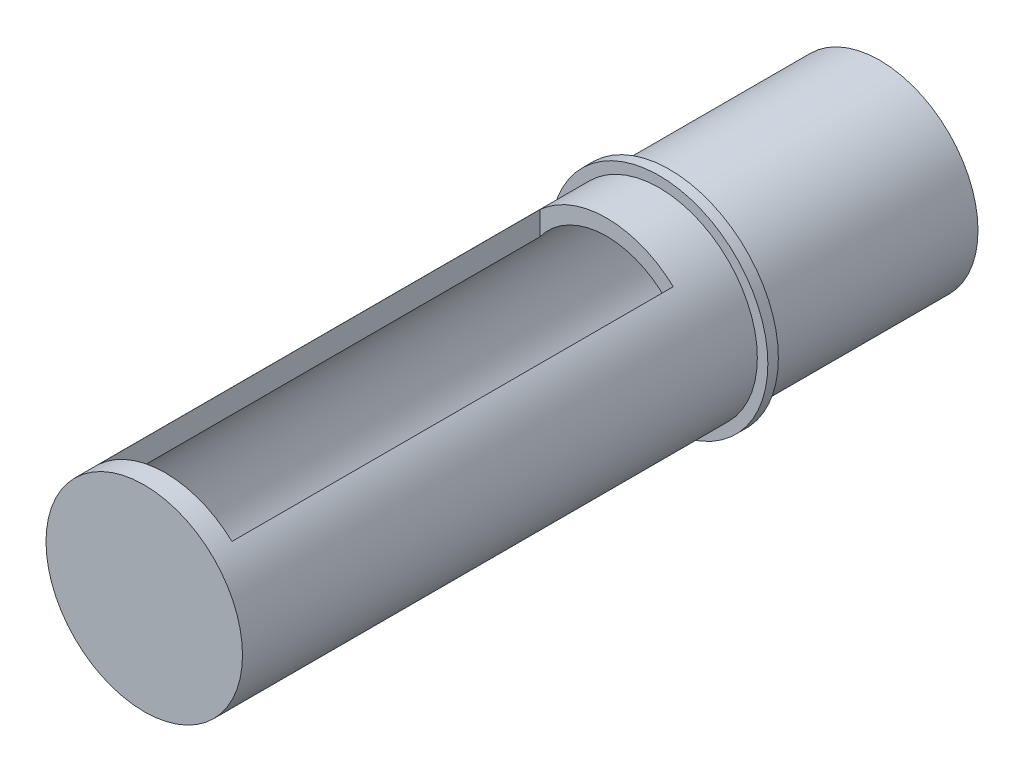
ISO-10303-21;
HEADER;
FILE_DESCRIPTION(('STEP AP214'),'2;1');
FILE_NAME('part.step','',(''),(''),'','','');
FILE_SCHEMA(('AUTOMOTIVE_DESIGN { 1 0 10303 214 1 1 1 1 }'));
ENDSEC;
DATA;
#1=APPLICATION_CONTEXT('core data for automotive mechanical design processes');
#2=APPLICATION_PROTOCOL_DEFINITION('international standard','automotive_design',2000,#1);
#3=PRODUCT_CONTEXT('',#1,'mechanical');
#4=PRODUCT('Part','Part','',(#3));
#5=PRODUCT_RELATED_PRODUCT_CATEGORY('part','',(#4));
#6=PRODUCT_DEFINITION_FORMATION('','',#4);
#7=PRODUCT_DEFINITION_CONTEXT('part definition',#1,'design');
#8=PRODUCT_DEFINITION('design','',#6,#7);
#9=PRODUCT_DEFINITION_SHAPE('','',#8);
#10=(LENGTH_UNIT() NAMED_UNIT(*) SI_UNIT(.MILLI.,.METRE.));
#11=(NAMED_UNIT(*) PLANE_ANGLE_UNIT() SI_UNIT($,.RADIAN.));
#12=(NAMED_UNIT(*) SI_UNIT($,.STERADIAN.) SOLID_ANGLE_UNIT());
#13=UNCERTAINTY_MEASURE_WITH_UNIT(LENGTH_MEASURE(1.E-05),#10,'distance_accuracy_value','');
#14=(GEOMETRIC_REPRESENTATION_CONTEXT(3) GLOBAL_UNCERTAINTY_ASSIGNED_CONTEXT((#13)) GLOBAL_UNIT_ASSIGNED_CONTEXT((#10,
#11,#12)) REPRESENTATION_CONTEXT('',''));
#15=CARTESIAN_POINT('',(0.,0.,0.));
#16=DIRECTION('',(0.,0.,1.));
#17=DIRECTION('',(1.,0.,0.));
#18=AXIS2_PLACEMENT_3D('',#15,#16,#17);
#19=CARTESIAN_POINT('',(0.,0.,-20.));
#20=DIRECTION('',(0.,0.,1.));
#21=DIRECTION('',(1.,0.,0.));
#22=AXIS2_PLACEMENT_3D('',#19,#20,#21);
#23=CYLINDRICAL_SURFACE('',#22,7.85);
#24=CARTESIAN_POINT('',(0.,0.,-20.));
#25=DIRECTION('',(0.,0.,1.));
#26=DIRECTION('',(1.,0.,0.));
#27=AXIS2_PLACEMENT_3D('',#24,#25,#26);
#28=CIRCLE('',#27,7.85);
#29=CARTESIAN_POINT('',(7.85,0.,-20.));
#30=VERTEX_POINT('',#29);
#31=EDGE_CURVE('E111',#30,#30,#28,.T.);
#32=ORIENTED_EDGE('',*,*,#31,.F.);
#33=EDGE_LOOP('',(#32));
#34=FACE_BOUND('',#33,.T.);
#35=DIRECTION('',(0.,0.,1.));
#36=VECTOR('',#35,1.);
#37=CARTESIAN_POINT('',(6.35,4.61519230368573,-20.));
#38=LINE('',#37,#36);
#39=CARTESIAN_POINT('',(6.35,4.61519230368573,6.));
#40=VERTEX_POINT('',#39);
#41=CARTESIAN_POINT('',(6.35,4.61519230368573,48.));
#42=VERTEX_POINT('',#41);
#43=EDGE_CURVE('E133',#40,#42,#38,.T.);
#44=ORIENTED_EDGE('',*,*,#43,.F.);
#45=CARTESIAN_POINT('',(0.,0.,6.));
#46=DIRECTION('',(0.,0.,1.));
#47=DIRECTION('',(1.,0.,0.));
#48=AXIS2_PLACEMENT_3D('',#45,#46,#47);
#49=CIRCLE('',#48,7.85);
#50=CARTESIAN_POINT('',(-6.35,4.61519230368573,6.));
#51=VERTEX_POINT('',#50);
#52=EDGE_CURVE('E94',#51,#40,#49,.F.);
#53=ORIENTED_EDGE('',*,*,#52,.F.);
#54=DIRECTION('',(0.,0.,1.));
#55=VECTOR('',#54,1.);
#56=CARTESIAN_POINT('',(-6.35,4.61519230368573,-20.));
#57=LINE('',#56,#55);
#58=CARTESIAN_POINT('',(-6.35,4.61519230368573,48.));
#59=VERTEX_POINT('',#58);
#60=EDGE_CURVE('E81',#59,#51,#57,.F.);
#61=ORIENTED_EDGE('',*,*,#60,.F.);
#62=CARTESIAN_POINT('',(0.,0.,48.));
#63=DIRECTION('',(0.,0.,1.));
#64=DIRECTION('',(1.,0.,0.));
#65=AXIS2_PLACEMENT_3D('',#62,#63,#64);
#66=CIRCLE('',#65,7.85);
#67=EDGE_CURVE('E93',#42,#59,#66,.F.);
#68=ORIENTED_EDGE('',*,*,#67,.F.);
#69=EDGE_LOOP('',(#44,#53,#61,#68));
#70=FACE_BOUND('',#69,.T.);
#71=ADVANCED_FACE('F39',(#34,#70),#23,.F.);
#72=CARTESIAN_POINT('',(0.,0.,-20.));
#73=DIRECTION('',(0.,0.,1.));
#74=DIRECTION('',(1.,0.,0.));
#75=AXIS2_PLACEMENT_3D('',#72,#73,#74);
#76=CYLINDRICAL_SURFACE('',#75,9.35);
#77=CARTESIAN_POINT('',(0.,0.,1.));
#78=DIRECTION('',(0.,0.,1.));
#79=DIRECTION('',(1.,0.,0.));
#80=AXIS2_PLACEMENT_3D('',#77,#78,#79);
#81=CIRCLE('',#80,9.35);
#82=CARTESIAN_POINT('',(9.35,0.,1.));
#83=VERTEX_POINT('',#82);
#84=EDGE_CURVE('E100',#83,#83,#81,.F.);
#85=ORIENTED_EDGE('',*,*,#84,.F.);
#86=EDGE_LOOP('',(#85));
#87=FACE_BOUND('',#86,.T.);
#88=CARTESIAN_POINT('',(0.,0.,50.));
#89=DIRECTION('',(0.,0.,1.));
#90=DIRECTION('',(1.,0.,0.));
#91=AXIS2_PLACEMENT_3D('',#88,#89,#90);
#92=CIRCLE('',#91,9.35);
#93=CARTESIAN_POINT('',(9.35,0.,50.));
#94=VERTEX_POINT('',#93);
#95=EDGE_CURVE('E115',#94,#94,#92,.T.);
#96=ORIENTED_EDGE('',*,*,#95,.F.);
#97=EDGE_LOOP('',(#96));
#98=FACE_BOUND('',#97,.T.);
#99=CARTESIAN_POINT('',(0.,0.,6.));
#100=DIRECTION('',(0.,0.,1.));
#101=DIRECTION('',(1.,0.,0.));
#102=AXIS2_PLACEMENT_3D('',#99,#100,#101);
#103=CIRCLE('',#102,9.35);
#104=CARTESIAN_POINT('',(-6.35,6.8629439747094,6.));
#105=VERTEX_POINT('',#104);
#106=CARTESIAN_POINT('',(6.35,6.86294397470939,6.));
#107=VERTEX_POINT('',#106);
#108=EDGE_CURVE('E11',#105,#107,#103,.F.);
#109=ORIENTED_EDGE('',*,*,#108,.T.);
#110=DIRECTION('',(0.,0.,1.));
#111=VECTOR('',#110,1.);
#112=CARTESIAN_POINT('',(6.35,6.86294397470939,-20.));
#113=LINE('',#112,#111);
#114=CARTESIAN_POINT('',(6.35,6.86294397470939,48.));
#115=VERTEX_POINT('',#114);
#116=EDGE_CURVE('E96',#107,#115,#113,.T.);
#117=ORIENTED_EDGE('',*,*,#116,.T.);
#118=CARTESIAN_POINT('',(0.,0.,48.));
#119=DIRECTION('',(0.,0.,-1.));
#120=DIRECTION('',(-1.,0.,0.));
#121=AXIS2_PLACEMENT_3D('',#118,#119,#120);
#122=CIRCLE('',#121,9.35);
#123=CARTESIAN_POINT('',(-6.35,6.8629439747094,48.));
#124=VERTEX_POINT('',#123);
#125=EDGE_CURVE('E48',#115,#124,#122,.F.);
#126=ORIENTED_EDGE('',*,*,#125,.T.);
#127=DIRECTION('',(0.,0.,1.));
#128=VECTOR('',#127,1.);
#129=CARTESIAN_POINT('',(-6.35,6.8629439747094,-20.));
#130=LINE('',#129,#128);
#131=EDGE_CURVE('E84',#124,#105,#130,.F.);
#132=ORIENTED_EDGE('',*,*,#131,.T.);
#133=EDGE_LOOP('',(#109,#117,#126,#132));
#134=FACE_BOUND('',#133,.T.);
#135=ADVANCED_FACE('F41',(#87,#98,#134),#76,.T.);
#136=CARTESIAN_POINT('',(0.,0.,-20.));
#137=DIRECTION('',(0.,0.,1.));
#138=DIRECTION('',(1.,0.,0.));
#139=AXIS2_PLACEMENT_3D('',#136,#137,#138);
#140=CIRCLE('',#139,9.35);
#141=CARTESIAN_POINT('',(9.35,0.,-20.));
#142=VERTEX_POINT('',#141);
#143=EDGE_CURVE('E105',#142,#142,#140,.T.);
#144=ORIENTED_EDGE('',*,*,#143,.T.);
#145=EDGE_LOOP('',(#144));
#146=FACE_BOUND('',#145,.T.);
#147=CARTESIAN_POINT('',(0.,0.,0.));
#148=DIRECTION('',(0.,0.,1.));
#149=DIRECTION('',(1.,0.,0.));
#150=AXIS2_PLACEMENT_3D('',#147,#148,#149);
#151=CIRCLE('',#150,9.35);
#152=CARTESIAN_POINT('',(9.35,0.,0.));
#153=VERTEX_POINT('',#152);
#154=EDGE_CURVE('E124',#153,#153,#151,.T.);
#155=ORIENTED_EDGE('',*,*,#154,.F.);
#156=EDGE_LOOP('',(#155));
#157=FACE_BOUND('',#156,.T.);
#158=ADVANCED_FACE('F169',(#146,#157),#76,.T.);
#159=CARTESIAN_POINT('',(0.,0.,-20.));
#160=DIRECTION('',(0.,0.,1.));
#161=DIRECTION('',(1.,0.,0.));
#162=AXIS2_PLACEMENT_3D('',#159,#160,#161);
#163=PLANE('',#162);
#164=ORIENTED_EDGE('',*,*,#31,.T.);
#165=EDGE_LOOP('',(#164));
#166=FACE_BOUND('',#165,.T.);
#167=ORIENTED_EDGE('',*,*,#143,.F.);
#168=EDGE_LOOP('',(#167));
#169=FACE_BOUND('',#168,.T.);
#170=ADVANCED_FACE('F175',(#166,#169),#163,.F.);
#171=CARTESIAN_POINT('',(0.,0.,50.));
#172=DIRECTION('',(0.,0.,1.));
#173=DIRECTION('',(1.,0.,0.));
#174=AXIS2_PLACEMENT_3D('',#171,#172,#173);
#175=PLANE('',#174);
#176=ORIENTED_EDGE('',*,*,#95,.T.);
#177=EDGE_LOOP('',(#176));
#178=FACE_BOUND('',#177,.T.);
#179=ADVANCED_FACE('F173',(#178),#175,.T.);
#180=CARTESIAN_POINT('',(0.,0.,1.));
#181=DIRECTION('',(0.,0.,1.));
#182=DIRECTION('',(1.,0.,0.));
#183=AXIS2_PLACEMENT_3D('',#180,#181,#182);
#184=PLANE('',#183);
#185=CARTESIAN_POINT('',(0.,0.,1.));
#186=DIRECTION('',(0.,0.,1.));
#187=DIRECTION('',(1.,0.,0.));
#188=AXIS2_PLACEMENT_3D('',#185,#186,#187);
#189=CIRCLE('',#188,10.35);
#190=CARTESIAN_POINT('',(10.35,0.,1.));
#191=VERTEX_POINT('',#190);
#192=EDGE_CURVE('E119',#191,#191,#189,.T.);
#193=ORIENTED_EDGE('',*,*,#192,.T.);
#194=EDGE_LOOP('',(#193));
#195=FACE_BOUND('',#194,.T.);
#196=ORIENTED_EDGE('',*,*,#84,.T.);
#197=EDGE_LOOP('',(#196));
#198=FACE_BOUND('',#197,.T.);
#199=ADVANCED_FACE('F182',(#195,#198),#184,.T.);
#200=CARTESIAN_POINT('',(0.,0.,0.));
#201=DIRECTION('',(0.,0.,1.));
#202=DIRECTION('',(1.,0.,0.));
#203=AXIS2_PLACEMENT_3D('',#200,#201,#202);
#204=PLANE('',#203);
#205=CARTESIAN_POINT('',(0.,0.,0.));
#206=DIRECTION('',(0.,0.,1.));
#207=DIRECTION('',(1.,0.,0.));
#208=AXIS2_PLACEMENT_3D('',#205,#206,#207);
#209=CIRCLE('',#208,10.35);
#210=CARTESIAN_POINT('',(10.35,0.,0.));
#211=VERTEX_POINT('',#210);
#212=EDGE_CURVE('E120',#211,#211,#209,.T.);
#213=ORIENTED_EDGE('',*,*,#212,.F.);
#214=EDGE_LOOP('',(#213));
#215=FACE_BOUND('',#214,.T.);
#216=ORIENTED_EDGE('',*,*,#154,.T.);
#217=EDGE_LOOP('',(#216));
#218=FACE_BOUND('',#217,.T.);
#219=ADVANCED_FACE('F190',(#215,#218),#204,.F.);
#220=CARTESIAN_POINT('',(0.,0.,1.));
#221=DIRECTION('',(0.,0.,-1.));
#222=DIRECTION('',(-1.,0.,0.));
#223=AXIS2_PLACEMENT_3D('',#220,#221,#222);
#224=CYLINDRICAL_SURFACE('',#223,10.35);
#225=ORIENTED_EDGE('',*,*,#192,.F.);
#226=EDGE_LOOP('',(#225));
#227=FACE_BOUND('',#226,.T.);
#228=ORIENTED_EDGE('',*,*,#212,.T.);
#229=EDGE_LOOP('',(#228));
#230=FACE_BOUND('',#229,.T.);
#231=ADVANCED_FACE('F192',(#227,#230),#224,.T.);
#232=CARTESIAN_POINT('',(0.,0.,48.));
#233=DIRECTION('',(0.,0.,1.));
#234=DIRECTION('',(1.,0.,0.));
#235=AXIS2_PLACEMENT_3D('',#232,#233,#234);
#236=PLANE('',#235);
#237=ORIENTED_EDGE('',*,*,#67,.T.);
#238=DIRECTION('',(0.,-1.,0.));
#239=VECTOR('',#238,1.);
#240=CARTESIAN_POINT('',(-6.35,21.,48.));
#241=LINE('',#240,#239);
#242=EDGE_CURVE('E55',#124,#59,#241,.T.);
#243=ORIENTED_EDGE('',*,*,#242,.F.);
#244=ORIENTED_EDGE('',*,*,#125,.F.);
#245=DIRECTION('',(0.,-1.,0.));
#246=VECTOR('',#245,1.);
#247=CARTESIAN_POINT('',(6.35,21.,48.));
#248=LINE('',#247,#246);
#249=EDGE_CURVE('E60',#115,#42,#248,.T.);
#250=ORIENTED_EDGE('',*,*,#249,.T.);
#251=EDGE_LOOP('',(#237,#243,#244,#250));
#252=FACE_BOUND('',#251,.T.);
#253=ADVANCED_FACE('F98',(#252),#236,.F.);
#254=CARTESIAN_POINT('',(-6.35,21.,6.));
#255=DIRECTION('',(0.,0.,1.));
#256=DIRECTION('',(1.,0.,0.));
#257=AXIS2_PLACEMENT_3D('',#254,#255,#256);
#258=PLANE('',#257);
#259=ORIENTED_EDGE('',*,*,#52,.T.);
#260=DIRECTION('',(0.,-1.,0.));
#261=VECTOR('',#260,1.);
#262=CARTESIAN_POINT('',(6.35,21.,6.));
#263=LINE('',#262,#261);
#264=EDGE_CURVE('E141',#107,#40,#263,.T.);
#265=ORIENTED_EDGE('',*,*,#264,.F.);
#266=ORIENTED_EDGE('',*,*,#108,.F.);
#267=DIRECTION('',(0.,-1.,0.));
#268=VECTOR('',#267,1.);
#269=CARTESIAN_POINT('',(-6.35,21.,6.));
#270=LINE('',#269,#268);
#271=EDGE_CURVE('E87',#105,#51,#270,.T.);
#272=ORIENTED_EDGE('',*,*,#271,.T.);
#273=EDGE_LOOP('',(#259,#265,#266,#272));
#274=FACE_BOUND('',#273,.T.);
#275=ADVANCED_FACE('F149',(#274),#258,.T.);
#276=CARTESIAN_POINT('',(6.35,21.,48.));
#277=DIRECTION('',(-1.,0.,0.));
#278=DIRECTION('',(0.,0.,1.));
#279=AXIS2_PLACEMENT_3D('',#276,#277,#278);
#280=PLANE('',#279);
#281=ORIENTED_EDGE('',*,*,#43,.T.);
#282=ORIENTED_EDGE('',*,*,#249,.F.);
#283=ORIENTED_EDGE('',*,*,#116,.F.);
#284=ORIENTED_EDGE('',*,*,#264,.T.);
#285=EDGE_LOOP('',(#281,#282,#283,#284));
#286=FACE_BOUND('',#285,.T.);
#287=ADVANCED_FACE('F153',(#286),#280,.T.);
#288=CARTESIAN_POINT('',(-6.35,21.,48.));
#289=DIRECTION('',(1.,0.,0.));
#290=DIRECTION('',(0.,0.,-1.));
#291=AXIS2_PLACEMENT_3D('',#288,#289,#290);
#292=PLANE('',#291);
#293=ORIENTED_EDGE('',*,*,#60,.T.);
#294=ORIENTED_EDGE('',*,*,#271,.F.);
#295=ORIENTED_EDGE('',*,*,#131,.F.);
#296=ORIENTED_EDGE('',*,*,#242,.T.);
#297=EDGE_LOOP('',(#293,#294,#295,#296));
#298=FACE_BOUND('',#297,.T.);
#299=ADVANCED_FACE('F79',(#298),#292,.T.);
#300=CLOSED_SHELL('',(#71,#135,#158,#170,#179,#199,#219,#231,#253,#275,#287,#299));
#301=MANIFOLD_SOLID_BREP('B2',#300);
#302=ADVANCED_BREP_SHAPE_REPRESENTATION('',(#18,#301),#14);
#303=SHAPE_DEFINITION_REPRESENTATION(#9,#302);
ENDSEC;
END-ISO-10303-21;
